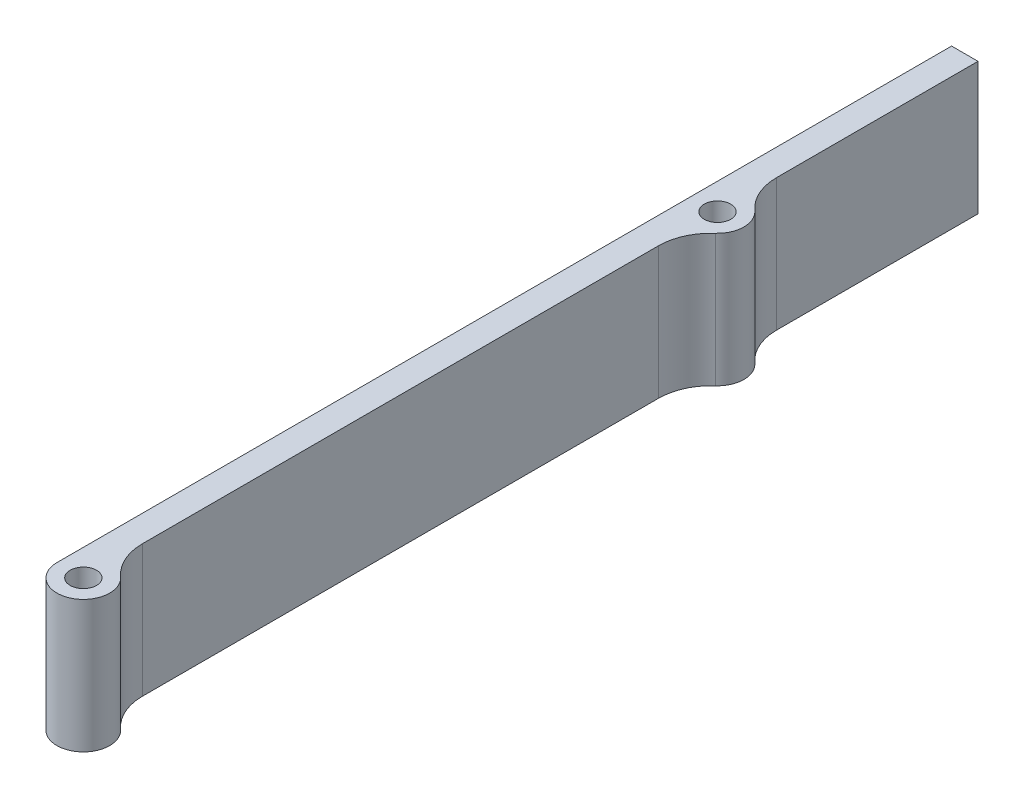
ISO-10303-21;
HEADER;
FILE_DESCRIPTION(('STEP AP214'),'2;1');
FILE_NAME('part.step','',(''),(''),'','','');
FILE_SCHEMA(('AUTOMOTIVE_DESIGN { 1 0 10303 214 1 1 1 1 }'));
ENDSEC;
DATA;
#1=APPLICATION_CONTEXT('core data for automotive mechanical design processes');
#2=APPLICATION_PROTOCOL_DEFINITION('international standard','automotive_design',2000,#1);
#3=PRODUCT_CONTEXT('',#1,'mechanical');
#4=PRODUCT('Part','Part','',(#3));
#5=PRODUCT_RELATED_PRODUCT_CATEGORY('part','',(#4));
#6=PRODUCT_DEFINITION_FORMATION('','',#4);
#7=PRODUCT_DEFINITION_CONTEXT('part definition',#1,'design');
#8=PRODUCT_DEFINITION('design','',#6,#7);
#9=PRODUCT_DEFINITION_SHAPE('','',#8);
#10=(LENGTH_UNIT() NAMED_UNIT(*) SI_UNIT(.MILLI.,.METRE.));
#11=(NAMED_UNIT(*) PLANE_ANGLE_UNIT() SI_UNIT($,.RADIAN.));
#12=(NAMED_UNIT(*) SI_UNIT($,.STERADIAN.) SOLID_ANGLE_UNIT());
#13=UNCERTAINTY_MEASURE_WITH_UNIT(LENGTH_MEASURE(1.E-05),#10,'distance_accuracy_value','');
#14=(GEOMETRIC_REPRESENTATION_CONTEXT(3) GLOBAL_UNCERTAINTY_ASSIGNED_CONTEXT((#13)) GLOBAL_UNIT_ASSIGNED_CONTEXT((#10,
#11,#12)) REPRESENTATION_CONTEXT('',''));
#15=CARTESIAN_POINT('',(0.,0.,0.));
#16=DIRECTION('',(0.,0.,1.));
#17=DIRECTION('',(1.,0.,0.));
#18=AXIS2_PLACEMENT_3D('',#15,#16,#17);
#19=CARTESIAN_POINT('',(15.,25.,4.27210511929188));
#20=DIRECTION('',(0.,1.,0.));
#21=DIRECTION('',(0.,0.,1.));
#22=AXIS2_PLACEMENT_3D('',#19,#20,#21);
#23=PLANE('',#22);
#24=CARTESIAN_POINT('',(5.,25.,15.4524450067908));
#25=DIRECTION('',(0.,1.,0.));
#26=DIRECTION('',(0.,0.,1.));
#27=AXIS2_PLACEMENT_3D('',#24,#25,#26);
#28=CIRCLE('',#27,2.5);
#29=CARTESIAN_POINT('',(5.,25.,17.9524450067908));
#30=VERTEX_POINT('',#29);
#31=EDGE_CURVE('E147',#30,#30,#28,.T.);
#32=ORIENTED_EDGE('',*,*,#31,.F.);
#33=EDGE_LOOP('',(#32));
#34=FACE_BOUND('',#33,.T.);
#35=DIRECTION('',(-1.,0.,0.));
#36=VECTOR('',#35,1.);
#37=CARTESIAN_POINT('',(0.,25.,-33.8475549932092));
#38=LINE('',#37,#36);
#39=CARTESIAN_POINT('',(5.,25.,-33.8475549932092));
#40=VERTEX_POINT('',#39);
#41=CARTESIAN_POINT('',(0.,25.,-33.8475549932092));
#42=VERTEX_POINT('',#41);
#43=EDGE_CURVE('E160',#40,#42,#38,.T.);
#44=ORIENTED_EDGE('',*,*,#43,.T.);
#45=DIRECTION('',(0.,0.,1.));
#46=VECTOR('',#45,1.);
#47=CARTESIAN_POINT('',(0.,25.,-33.8475549932092));
#48=LINE('',#47,#46);
#49=CARTESIAN_POINT('',(0.,25.,135.452445006791));
#50=VERTEX_POINT('',#49);
#51=EDGE_CURVE('E103',#42,#50,#48,.T.);
#52=ORIENTED_EDGE('',*,*,#51,.T.);
#53=CARTESIAN_POINT('',(5.,25.,135.452445006791));
#54=DIRECTION('',(0.,1.,0.));
#55=DIRECTION('',(0.,0.,1.));
#56=AXIS2_PLACEMENT_3D('',#53,#54,#55);
#57=CIRCLE('',#56,5.);
#58=CARTESIAN_POINT('',(8.33333333333334,25.,131.725665044291));
#59=VERTEX_POINT('',#58);
#60=EDGE_CURVE('E178',#50,#59,#57,.T.);
#61=ORIENTED_EDGE('',*,*,#60,.T.);
#62=CARTESIAN_POINT('',(15.,25.,124.272105119292));
#63=DIRECTION('',(0.,-1.,0.));
#64=DIRECTION('',(0.,0.,1.));
#65=AXIS2_PLACEMENT_3D('',#62,#63,#64);
#66=CIRCLE('',#65,10.);
#67=CARTESIAN_POINT('',(5.,25.,124.272105119292));
#68=VERTEX_POINT('',#67);
#69=EDGE_CURVE('E195',#59,#68,#66,.T.);
#70=ORIENTED_EDGE('',*,*,#69,.T.);
#71=DIRECTION('',(0.,0.,-1.));
#72=VECTOR('',#71,1.);
#73=CARTESIAN_POINT('',(5.,25.,26.6327848942898));
#74=LINE('',#73,#72);
#75=CARTESIAN_POINT('',(5.,25.,26.6327848942898));
#76=VERTEX_POINT('',#75);
#77=EDGE_CURVE('E194',#68,#76,#74,.T.);
#78=ORIENTED_EDGE('',*,*,#77,.T.);
#79=CARTESIAN_POINT('',(15.,25.,26.6327848942898));
#80=DIRECTION('',(0.,-1.,0.));
#81=DIRECTION('',(0.,0.,-1.));
#82=AXIS2_PLACEMENT_3D('',#79,#80,#81);
#83=CIRCLE('',#82,10.);
#84=CARTESIAN_POINT('',(8.33333333333333,25.,19.1792249692905));
#85=VERTEX_POINT('',#84);
#86=EDGE_CURVE('E125',#76,#85,#83,.T.);
#87=ORIENTED_EDGE('',*,*,#86,.T.);
#88=CARTESIAN_POINT('',(5.,25.,15.4524450067908));
#89=DIRECTION('',(0.,1.,0.));
#90=DIRECTION('',(0.,0.,-1.));
#91=AXIS2_PLACEMENT_3D('',#88,#89,#90);
#92=CIRCLE('',#91,5.);
#93=CARTESIAN_POINT('',(8.33333333333333,25.,11.7256650442912));
#94=VERTEX_POINT('',#93);
#95=EDGE_CURVE('E119',#85,#94,#92,.T.);
#96=ORIENTED_EDGE('',*,*,#95,.T.);
#97=CARTESIAN_POINT('',(15.,25.,4.27210511929188));
#98=DIRECTION('',(0.,-1.,0.));
#99=DIRECTION('',(0.,0.,1.));
#100=AXIS2_PLACEMENT_3D('',#97,#98,#99);
#101=CIRCLE('',#100,10.);
#102=CARTESIAN_POINT('',(5.,25.,4.27210511929187));
#103=VERTEX_POINT('',#102);
#104=EDGE_CURVE('E123',#94,#103,#101,.T.);
#105=ORIENTED_EDGE('',*,*,#104,.T.);
#106=DIRECTION('',(0.,0.,-1.));
#107=VECTOR('',#106,1.);
#108=CARTESIAN_POINT('',(5.,25.,-33.8475549932092));
#109=LINE('',#108,#107);
#110=EDGE_CURVE('E57',#103,#40,#109,.T.);
#111=ORIENTED_EDGE('',*,*,#110,.T.);
#112=EDGE_LOOP('',(#44,#52,#61,#70,#78,#87,#96,#105,#111));
#113=FACE_BOUND('',#112,.T.);
#114=CARTESIAN_POINT('',(5.,25.,135.452445006791));
#115=DIRECTION('',(0.,1.,0.));
#116=DIRECTION('',(0.,0.,1.));
#117=AXIS2_PLACEMENT_3D('',#114,#115,#116);
#118=CIRCLE('',#117,2.5);
#119=CARTESIAN_POINT('',(5.,25.,137.952445006791));
#120=VERTEX_POINT('',#119);
#121=EDGE_CURVE('E205',#120,#120,#118,.T.);
#122=ORIENTED_EDGE('',*,*,#121,.F.);
#123=EDGE_LOOP('',(#122));
#124=FACE_BOUND('',#123,.T.);
#125=ADVANCED_FACE('F40',(#34,#113,#124),#23,.T.);
#126=CARTESIAN_POINT('',(15.,0.,4.27210511929188));
#127=DIRECTION('',(0.,1.,0.));
#128=DIRECTION('',(0.,0.,1.));
#129=AXIS2_PLACEMENT_3D('',#126,#127,#128);
#130=PLANE('',#129);
#131=DIRECTION('',(-1.,0.,0.));
#132=VECTOR('',#131,1.);
#133=CARTESIAN_POINT('',(0.,0.,-33.8475549932092));
#134=LINE('',#133,#132);
#135=CARTESIAN_POINT('',(5.,0.,-33.8475549932092));
#136=VERTEX_POINT('',#135);
#137=CARTESIAN_POINT('',(0.,0.,-33.8475549932092));
#138=VERTEX_POINT('',#137);
#139=EDGE_CURVE('E143',#136,#138,#134,.T.);
#140=ORIENTED_EDGE('',*,*,#139,.F.);
#141=DIRECTION('',(0.,0.,-1.));
#142=VECTOR('',#141,1.);
#143=CARTESIAN_POINT('',(5.,0.,-33.8475549932092));
#144=LINE('',#143,#142);
#145=CARTESIAN_POINT('',(5.,0.,4.27210511929187));
#146=VERTEX_POINT('',#145);
#147=EDGE_CURVE('E95',#146,#136,#144,.T.);
#148=ORIENTED_EDGE('',*,*,#147,.F.);
#149=CARTESIAN_POINT('',(15.,0.,4.27210511929188));
#150=DIRECTION('',(0.,-1.,0.));
#151=DIRECTION('',(0.,0.,1.));
#152=AXIS2_PLACEMENT_3D('',#149,#150,#151);
#153=CIRCLE('',#152,10.);
#154=CARTESIAN_POINT('',(8.33333333333333,0.,11.7256650442912));
#155=VERTEX_POINT('',#154);
#156=EDGE_CURVE('E89',#155,#146,#153,.T.);
#157=ORIENTED_EDGE('',*,*,#156,.F.);
#158=CARTESIAN_POINT('',(5.,0.,15.4524450067908));
#159=DIRECTION('',(0.,1.,0.));
#160=DIRECTION('',(0.,0.,-1.));
#161=AXIS2_PLACEMENT_3D('',#158,#159,#160);
#162=CIRCLE('',#161,5.);
#163=CARTESIAN_POINT('',(8.33333333333333,0.,19.1792249692905));
#164=VERTEX_POINT('',#163);
#165=EDGE_CURVE('E133',#164,#155,#162,.T.);
#166=ORIENTED_EDGE('',*,*,#165,.F.);
#167=CARTESIAN_POINT('',(15.,0.,26.6327848942898));
#168=DIRECTION('',(0.,-1.,0.));
#169=DIRECTION('',(0.,0.,-1.));
#170=AXIS2_PLACEMENT_3D('',#167,#168,#169);
#171=CIRCLE('',#170,10.);
#172=CARTESIAN_POINT('',(5.,0.,26.6327848942898));
#173=VERTEX_POINT('',#172);
#174=EDGE_CURVE('E155',#173,#164,#171,.T.);
#175=ORIENTED_EDGE('',*,*,#174,.F.);
#176=DIRECTION('',(0.,0.,-1.));
#177=VECTOR('',#176,1.);
#178=CARTESIAN_POINT('',(5.,0.,26.6327848942898));
#179=LINE('',#178,#177);
#180=CARTESIAN_POINT('',(5.,0.,124.272105119292));
#181=VERTEX_POINT('',#180);
#182=EDGE_CURVE('E153',#181,#173,#179,.T.);
#183=ORIENTED_EDGE('',*,*,#182,.F.);
#184=CARTESIAN_POINT('',(15.,0.,124.272105119292));
#185=DIRECTION('',(0.,-1.,0.));
#186=DIRECTION('',(0.,0.,1.));
#187=AXIS2_PLACEMENT_3D('',#184,#185,#186);
#188=CIRCLE('',#187,10.);
#189=CARTESIAN_POINT('',(8.33333333333334,0.,131.725665044291));
#190=VERTEX_POINT('',#189);
#191=EDGE_CURVE('E151',#190,#181,#188,.T.);
#192=ORIENTED_EDGE('',*,*,#191,.F.);
#193=CARTESIAN_POINT('',(5.,0.,135.452445006791));
#194=DIRECTION('',(0.,1.,0.));
#195=DIRECTION('',(0.,0.,1.));
#196=AXIS2_PLACEMENT_3D('',#193,#194,#195);
#197=CIRCLE('',#196,5.);
#198=CARTESIAN_POINT('',(0.,0.,135.452445006791));
#199=VERTEX_POINT('',#198);
#200=EDGE_CURVE('E149',#199,#190,#197,.T.);
#201=ORIENTED_EDGE('',*,*,#200,.F.);
#202=DIRECTION('',(0.,0.,1.));
#203=VECTOR('',#202,1.);
#204=CARTESIAN_POINT('',(0.,0.,-33.8475549932092));
#205=LINE('',#204,#203);
#206=EDGE_CURVE('E146',#138,#199,#205,.T.);
#207=ORIENTED_EDGE('',*,*,#206,.F.);
#208=EDGE_LOOP('',(#140,#148,#157,#166,#175,#183,#192,#201,#207));
#209=FACE_BOUND('',#208,.T.);
#210=CARTESIAN_POINT('',(5.,0.,15.4524450067908));
#211=DIRECTION('',(0.,1.,0.));
#212=DIRECTION('',(0.,0.,1.));
#213=AXIS2_PLACEMENT_3D('',#210,#211,#212);
#214=CIRCLE('',#213,2.5);
#215=CARTESIAN_POINT('',(5.,0.,17.9524450067908));
#216=VERTEX_POINT('',#215);
#217=EDGE_CURVE('E202',#216,#216,#214,.T.);
#218=ORIENTED_EDGE('',*,*,#217,.T.);
#219=EDGE_LOOP('',(#218));
#220=FACE_BOUND('',#219,.T.);
#221=CARTESIAN_POINT('',(5.,0.,135.452445006791));
#222=DIRECTION('',(0.,1.,0.));
#223=DIRECTION('',(0.,0.,1.));
#224=AXIS2_PLACEMENT_3D('',#221,#222,#223);
#225=CIRCLE('',#224,2.5);
#226=CARTESIAN_POINT('',(5.,0.,137.952445006791));
#227=VERTEX_POINT('',#226);
#228=EDGE_CURVE('E208',#227,#227,#225,.T.);
#229=ORIENTED_EDGE('',*,*,#228,.T.);
#230=EDGE_LOOP('',(#229));
#231=FACE_BOUND('',#230,.T.);
#232=ADVANCED_FACE('F182',(#209,#220,#231),#130,.F.);
#233=CARTESIAN_POINT('',(0.,25.,-33.8475549932092));
#234=DIRECTION('',(0.,0.,1.));
#235=DIRECTION('',(1.,0.,0.));
#236=AXIS2_PLACEMENT_3D('',#233,#234,#235);
#237=PLANE('',#236);
#238=CARTESIAN_POINT('',(2.5,10.,-33.8475549932092));
#239=DIRECTION('',(0.,0.,-1.));
#240=DIRECTION('',(-1.,0.,0.));
#241=AXIS2_PLACEMENT_3D('',#238,#239,#240);
#242=CIRCLE('',#241,1.);
#243=CARTESIAN_POINT('',(1.5,10.,-33.8475549932092));
#244=VERTEX_POINT('',#243);
#245=EDGE_CURVE('E220',#244,#244,#242,.T.);
#246=ORIENTED_EDGE('',*,*,#245,.F.);
#247=EDGE_LOOP('',(#246));
#248=FACE_BOUND('',#247,.T.);
#249=CARTESIAN_POINT('',(2.5,20.,-33.8475549932092));
#250=DIRECTION('',(0.,0.,-1.));
#251=DIRECTION('',(-1.,0.,0.));
#252=AXIS2_PLACEMENT_3D('',#249,#250,#251);
#253=CIRCLE('',#252,1.);
#254=CARTESIAN_POINT('',(1.5,20.,-33.8475549932092));
#255=VERTEX_POINT('',#254);
#256=EDGE_CURVE('E217',#255,#255,#253,.T.);
#257=ORIENTED_EDGE('',*,*,#256,.F.);
#258=EDGE_LOOP('',(#257));
#259=FACE_BOUND('',#258,.T.);
#260=ORIENTED_EDGE('',*,*,#139,.T.);
#261=DIRECTION('',(0.,-1.,0.));
#262=VECTOR('',#261,1.);
#263=CARTESIAN_POINT('',(0.,25.,-33.8475549932092));
#264=LINE('',#263,#262);
#265=EDGE_CURVE('E11',#42,#138,#264,.T.);
#266=ORIENTED_EDGE('',*,*,#265,.F.);
#267=ORIENTED_EDGE('',*,*,#43,.F.);
#268=DIRECTION('',(0.,-1.,0.));
#269=VECTOR('',#268,1.);
#270=CARTESIAN_POINT('',(5.,25.,-33.8475549932092));
#271=LINE('',#270,#269);
#272=EDGE_CURVE('E139',#40,#136,#271,.T.);
#273=ORIENTED_EDGE('',*,*,#272,.T.);
#274=EDGE_LOOP('',(#260,#266,#267,#273));
#275=FACE_BOUND('',#274,.T.);
#276=ADVANCED_FACE('F42',(#248,#259,#275),#237,.F.);
#277=CARTESIAN_POINT('',(0.,25.,-33.8475549932092));
#278=DIRECTION('',(1.,0.,0.));
#279=DIRECTION('',(0.,0.,-1.));
#280=AXIS2_PLACEMENT_3D('',#277,#278,#279);
#281=PLANE('',#280);
#282=ORIENTED_EDGE('',*,*,#206,.T.);
#283=DIRECTION('',(0.,-1.,0.));
#284=VECTOR('',#283,1.);
#285=CARTESIAN_POINT('',(0.,25.,135.452445006791));
#286=LINE('',#285,#284);
#287=EDGE_CURVE('E49',#50,#199,#286,.T.);
#288=ORIENTED_EDGE('',*,*,#287,.F.);
#289=ORIENTED_EDGE('',*,*,#51,.F.);
#290=ORIENTED_EDGE('',*,*,#265,.T.);
#291=EDGE_LOOP('',(#282,#288,#289,#290));
#292=FACE_BOUND('',#291,.T.);
#293=ADVANCED_FACE('F237',(#292),#281,.F.);
#294=CARTESIAN_POINT('',(5.,25.,135.452445006791));
#295=DIRECTION('',(0.,-1.,0.));
#296=DIRECTION('',(0.,0.,-1.));
#297=AXIS2_PLACEMENT_3D('',#294,#295,#296);
#298=CYLINDRICAL_SURFACE('',#297,5.);
#299=ORIENTED_EDGE('',*,*,#200,.T.);
#300=DIRECTION('',(0.,-1.,0.));
#301=VECTOR('',#300,1.);
#302=CARTESIAN_POINT('',(8.33333333333334,25.,131.725665044291));
#303=LINE('',#302,#301);
#304=EDGE_CURVE('E170',#59,#190,#303,.T.);
#305=ORIENTED_EDGE('',*,*,#304,.F.);
#306=ORIENTED_EDGE('',*,*,#60,.F.);
#307=ORIENTED_EDGE('',*,*,#287,.T.);
#308=EDGE_LOOP('',(#299,#305,#306,#307));
#309=FACE_BOUND('',#308,.T.);
#310=ADVANCED_FACE('F176',(#309),#298,.T.);
#311=CARTESIAN_POINT('',(15.,25.,124.272105119292));
#312=DIRECTION('',(0.,-1.,0.));
#313=DIRECTION('',(0.,0.,-1.));
#314=AXIS2_PLACEMENT_3D('',#311,#312,#313);
#315=CYLINDRICAL_SURFACE('',#314,10.);
#316=ORIENTED_EDGE('',*,*,#191,.T.);
#317=DIRECTION('',(0.,-1.,0.));
#318=VECTOR('',#317,1.);
#319=CARTESIAN_POINT('',(5.,25.,124.272105119292));
#320=LINE('',#319,#318);
#321=EDGE_CURVE('E167',#68,#181,#320,.T.);
#322=ORIENTED_EDGE('',*,*,#321,.F.);
#323=ORIENTED_EDGE('',*,*,#69,.F.);
#324=ORIENTED_EDGE('',*,*,#304,.T.);
#325=EDGE_LOOP('',(#316,#322,#323,#324));
#326=FACE_BOUND('',#325,.T.);
#327=ADVANCED_FACE('F188',(#326),#315,.F.);
#328=CARTESIAN_POINT('',(5.,25.,26.6327848942898));
#329=DIRECTION('',(-1.,0.,0.));
#330=DIRECTION('',(0.,0.,1.));
#331=AXIS2_PLACEMENT_3D('',#328,#329,#330);
#332=PLANE('',#331);
#333=ORIENTED_EDGE('',*,*,#182,.T.);
#334=DIRECTION('',(0.,-1.,0.));
#335=VECTOR('',#334,1.);
#336=CARTESIAN_POINT('',(5.,25.,26.6327848942898));
#337=LINE('',#336,#335);
#338=EDGE_CURVE('E164',#76,#173,#337,.T.);
#339=ORIENTED_EDGE('',*,*,#338,.F.);
#340=ORIENTED_EDGE('',*,*,#77,.F.);
#341=ORIENTED_EDGE('',*,*,#321,.T.);
#342=EDGE_LOOP('',(#333,#339,#340,#341));
#343=FACE_BOUND('',#342,.T.);
#344=ADVANCED_FACE('F192',(#343),#332,.F.);
#345=CARTESIAN_POINT('',(15.,25.,26.6327848942898));
#346=DIRECTION('',(0.,-1.,0.));
#347=DIRECTION('',(0.,0.,-1.));
#348=AXIS2_PLACEMENT_3D('',#345,#346,#347);
#349=CYLINDRICAL_SURFACE('',#348,10.);
#350=ORIENTED_EDGE('',*,*,#174,.T.);
#351=DIRECTION('',(0.,-1.,0.));
#352=VECTOR('',#351,1.);
#353=CARTESIAN_POINT('',(8.33333333333333,25.,19.1792249692905));
#354=LINE('',#353,#352);
#355=EDGE_CURVE('E134',#85,#164,#354,.T.);
#356=ORIENTED_EDGE('',*,*,#355,.F.);
#357=ORIENTED_EDGE('',*,*,#86,.F.);
#358=ORIENTED_EDGE('',*,*,#338,.T.);
#359=EDGE_LOOP('',(#350,#356,#357,#358));
#360=FACE_BOUND('',#359,.T.);
#361=ADVANCED_FACE('F243',(#360),#349,.F.);
#362=CARTESIAN_POINT('',(5.,25.,15.4524450067908));
#363=DIRECTION('',(0.,-1.,0.));
#364=DIRECTION('',(0.,0.,-1.));
#365=AXIS2_PLACEMENT_3D('',#362,#363,#364);
#366=CYLINDRICAL_SURFACE('',#365,5.);
#367=ORIENTED_EDGE('',*,*,#165,.T.);
#368=DIRECTION('',(0.,-1.,0.));
#369=VECTOR('',#368,1.);
#370=CARTESIAN_POINT('',(8.33333333333333,25.,11.7256650442912));
#371=LINE('',#370,#369);
#372=EDGE_CURVE('E130',#94,#155,#371,.T.);
#373=ORIENTED_EDGE('',*,*,#372,.F.);
#374=ORIENTED_EDGE('',*,*,#95,.F.);
#375=ORIENTED_EDGE('',*,*,#355,.T.);
#376=EDGE_LOOP('',(#367,#373,#374,#375));
#377=FACE_BOUND('',#376,.T.);
#378=ADVANCED_FACE('F131',(#377),#366,.T.);
#379=CARTESIAN_POINT('',(15.,25.,4.27210511929188));
#380=DIRECTION('',(0.,-1.,0.));
#381=DIRECTION('',(0.,0.,-1.));
#382=AXIS2_PLACEMENT_3D('',#379,#380,#381);
#383=CYLINDRICAL_SURFACE('',#382,10.);
#384=ORIENTED_EDGE('',*,*,#156,.T.);
#385=DIRECTION('',(0.,-1.,0.));
#386=VECTOR('',#385,1.);
#387=CARTESIAN_POINT('',(5.,25.,4.27210511929187));
#388=LINE('',#387,#386);
#389=EDGE_CURVE('E135',#103,#146,#388,.T.);
#390=ORIENTED_EDGE('',*,*,#389,.F.);
#391=ORIENTED_EDGE('',*,*,#104,.F.);
#392=ORIENTED_EDGE('',*,*,#372,.T.);
#393=EDGE_LOOP('',(#384,#390,#391,#392));
#394=FACE_BOUND('',#393,.T.);
#395=ADVANCED_FACE('F137',(#394),#383,.F.);
#396=CARTESIAN_POINT('',(5.,25.,-33.8475549932092));
#397=DIRECTION('',(-1.,0.,0.));
#398=DIRECTION('',(0.,0.,1.));
#399=AXIS2_PLACEMENT_3D('',#396,#397,#398);
#400=PLANE('',#399);
#401=ORIENTED_EDGE('',*,*,#147,.T.);
#402=ORIENTED_EDGE('',*,*,#272,.F.);
#403=ORIENTED_EDGE('',*,*,#110,.F.);
#404=ORIENTED_EDGE('',*,*,#389,.T.);
#405=EDGE_LOOP('',(#401,#402,#403,#404));
#406=FACE_BOUND('',#405,.T.);
#407=ADVANCED_FACE('F264',(#406),#400,.F.);
#408=CARTESIAN_POINT('',(5.,25.,15.4524450067908));
#409=DIRECTION('',(0.,-1.,0.));
#410=DIRECTION('',(0.,0.,-1.));
#411=AXIS2_PLACEMENT_3D('',#408,#409,#410);
#412=CYLINDRICAL_SURFACE('',#411,2.5);
#413=ORIENTED_EDGE('',*,*,#31,.T.);
#414=EDGE_LOOP('',(#413));
#415=FACE_BOUND('',#414,.T.);
#416=ORIENTED_EDGE('',*,*,#217,.F.);
#417=EDGE_LOOP('',(#416));
#418=FACE_BOUND('',#417,.T.);
#419=ADVANCED_FACE('F261',(#415,#418),#412,.F.);
#420=CARTESIAN_POINT('',(5.,25.,135.452445006791));
#421=DIRECTION('',(0.,-1.,0.));
#422=DIRECTION('',(0.,0.,-1.));
#423=AXIS2_PLACEMENT_3D('',#420,#421,#422);
#424=CYLINDRICAL_SURFACE('',#423,2.5);
#425=ORIENTED_EDGE('',*,*,#121,.T.);
#426=EDGE_LOOP('',(#425));
#427=FACE_BOUND('',#426,.T.);
#428=ORIENTED_EDGE('',*,*,#228,.F.);
#429=EDGE_LOOP('',(#428));
#430=FACE_BOUND('',#429,.T.);
#431=ADVANCED_FACE('F282',(#427,#430),#424,.F.);
#432=CARTESIAN_POINT('',(2.5,20.,-8.84755499320918));
#433=DIRECTION('',(0.,0.,-1.));
#434=DIRECTION('',(-1.,0.,0.));
#435=AXIS2_PLACEMENT_3D('',#432,#433,#434);
#436=CYLINDRICAL_SURFACE('',#435,1.);
#437=CARTESIAN_POINT('',(2.5,20.,-8.84755499320918));
#438=DIRECTION('',(0.,0.,-1.));
#439=DIRECTION('',(-1.,0.,0.));
#440=AXIS2_PLACEMENT_3D('',#437,#438,#439);
#441=CIRCLE('',#440,1.);
#442=CARTESIAN_POINT('',(1.5,20.,-8.84755499320918));
#443=VERTEX_POINT('',#442);
#444=EDGE_CURVE('E214',#443,#443,#441,.T.);
#445=ORIENTED_EDGE('',*,*,#444,.F.);
#446=EDGE_LOOP('',(#445));
#447=FACE_BOUND('',#446,.T.);
#448=ORIENTED_EDGE('',*,*,#256,.T.);
#449=EDGE_LOOP('',(#448));
#450=FACE_BOUND('',#449,.T.);
#451=ADVANCED_FACE('F289',(#447,#450),#436,.F.);
#452=CARTESIAN_POINT('',(2.5,20.,-8.84755499320918));
#453=DIRECTION('',(0.,0.,-1.));
#454=DIRECTION('',(-1.,0.,0.));
#455=AXIS2_PLACEMENT_3D('',#452,#453,#454);
#456=PLANE('',#455);
#457=ORIENTED_EDGE('',*,*,#444,.T.);
#458=EDGE_LOOP('',(#457));
#459=FACE_BOUND('',#458,.T.);
#460=ADVANCED_FACE('F231',(#459),#456,.T.);
#461=CARTESIAN_POINT('',(2.5,10.,-8.84755499320918));
#462=DIRECTION('',(0.,0.,-1.));
#463=DIRECTION('',(-1.,0.,0.));
#464=AXIS2_PLACEMENT_3D('',#461,#462,#463);
#465=CYLINDRICAL_SURFACE('',#464,1.);
#466=CARTESIAN_POINT('',(2.5,10.,-8.84755499320918));
#467=DIRECTION('',(0.,0.,-1.));
#468=DIRECTION('',(-1.,0.,0.));
#469=AXIS2_PLACEMENT_3D('',#466,#467,#468);
#470=CIRCLE('',#469,1.);
#471=CARTESIAN_POINT('',(1.5,10.,-8.84755499320918));
#472=VERTEX_POINT('',#471);
#473=EDGE_CURVE('E211',#472,#472,#470,.T.);
#474=ORIENTED_EDGE('',*,*,#473,.F.);
#475=EDGE_LOOP('',(#474));
#476=FACE_BOUND('',#475,.T.);
#477=ORIENTED_EDGE('',*,*,#245,.T.);
#478=EDGE_LOOP('',(#477));
#479=FACE_BOUND('',#478,.T.);
#480=ADVANCED_FACE('F228',(#476,#479),#465,.F.);
#481=CARTESIAN_POINT('',(2.5,10.,-8.84755499320918));
#482=DIRECTION('',(0.,0.,-1.));
#483=DIRECTION('',(-1.,0.,0.));
#484=AXIS2_PLACEMENT_3D('',#481,#482,#483);
#485=PLANE('',#484);
#486=ORIENTED_EDGE('',*,*,#473,.T.);
#487=EDGE_LOOP('',(#486));
#488=FACE_BOUND('',#487,.T.);
#489=ADVANCED_FACE('F226',(#488),#485,.T.);
#490=CLOSED_SHELL('',(#125,#232,#276,#293,#310,#327,#344,#361,#378,#395,#407,#419,#431,#451,
#460,#480,#489));
#491=MANIFOLD_SOLID_BREP('B2',#490);
#492=ADVANCED_BREP_SHAPE_REPRESENTATION('',(#18,#491),#14);
#493=SHAPE_DEFINITION_REPRESENTATION(#9,#492);
ENDSEC;
END-ISO-10303-21;
